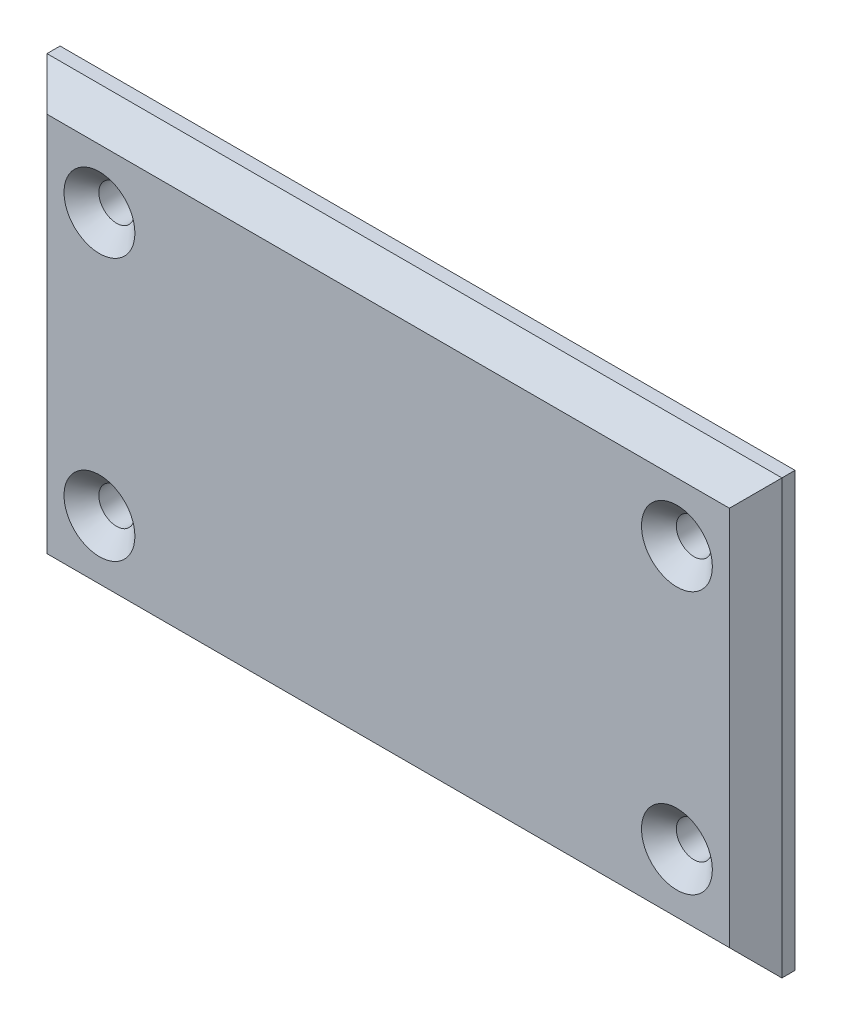
ISO-10303-21;
HEADER;
FILE_DESCRIPTION(('STEP AP214'),'2;1');
FILE_NAME('part.step','',(''),(''),'','','');
FILE_SCHEMA(('AUTOMOTIVE_DESIGN { 1 0 10303 214 1 1 1 1 }'));
ENDSEC;
DATA;
#1=APPLICATION_CONTEXT('core data for automotive mechanical design processes');
#2=APPLICATION_PROTOCOL_DEFINITION('international standard','automotive_design',2000,#1);
#3=PRODUCT_CONTEXT('',#1,'mechanical');
#4=PRODUCT('Part','Part','',(#3));
#5=PRODUCT_RELATED_PRODUCT_CATEGORY('part','',(#4));
#6=PRODUCT_DEFINITION_FORMATION('','',#4);
#7=PRODUCT_DEFINITION_CONTEXT('part definition',#1,'design');
#8=PRODUCT_DEFINITION('design','',#6,#7);
#9=PRODUCT_DEFINITION_SHAPE('','',#8);
#10=(LENGTH_UNIT() NAMED_UNIT(*) SI_UNIT(.MILLI.,.METRE.));
#11=(NAMED_UNIT(*) PLANE_ANGLE_UNIT() SI_UNIT($,.RADIAN.));
#12=(NAMED_UNIT(*) SI_UNIT($,.STERADIAN.) SOLID_ANGLE_UNIT());
#13=UNCERTAINTY_MEASURE_WITH_UNIT(LENGTH_MEASURE(1.E-05),#10,'distance_accuracy_value','');
#14=(GEOMETRIC_REPRESENTATION_CONTEXT(3) GLOBAL_UNCERTAINTY_ASSIGNED_CONTEXT((#13)) GLOBAL_UNIT_ASSIGNED_CONTEXT((#10,
#11,#12)) REPRESENTATION_CONTEXT('',''));
#15=CARTESIAN_POINT('',(0.,0.,0.));
#16=DIRECTION('',(0.,0.,1.));
#17=DIRECTION('',(1.,0.,0.));
#18=AXIS2_PLACEMENT_3D('',#15,#16,#17);
#19=CARTESIAN_POINT('',(140.,82.5,15.0000000000002));
#20=DIRECTION('',(-1.,0.,0.));
#21=DIRECTION('',(0.,-1.,0.));
#22=AXIS2_PLACEMENT_3D('',#19,#20,#21);
#23=PLANE('',#22);
#24=DIRECTION('',(0.,0.,-1.));
#25=VECTOR('',#24,1.);
#26=CARTESIAN_POINT('',(140.,82.5,15.0000000000002));
#27=LINE('',#26,#25);
#28=CARTESIAN_POINT('',(140.,82.5,5.00000000000023));
#29=VERTEX_POINT('',#28);
#30=CARTESIAN_POINT('',(140.,82.5,2.22044604925031E-13));
#31=VERTEX_POINT('',#30);
#32=EDGE_CURVE('E88',#29,#31,#27,.T.);
#33=ORIENTED_EDGE('',*,*,#32,.F.);
#34=DIRECTION('',(0.,-1.,0.));
#35=VECTOR('',#34,1.);
#36=CARTESIAN_POINT('',(140.,-82.5,5.00000000000023));
#37=LINE('',#36,#35);
#38=CARTESIAN_POINT('',(140.,-82.5,5.00000000000023));
#39=VERTEX_POINT('',#38);
#40=EDGE_CURVE('E58',#29,#39,#37,.T.);
#41=ORIENTED_EDGE('',*,*,#40,.T.);
#42=DIRECTION('',(0.,0.,-1.));
#43=VECTOR('',#42,1.);
#44=CARTESIAN_POINT('',(140.,-82.5,15.0000000000002));
#45=LINE('',#44,#43);
#46=CARTESIAN_POINT('',(140.,-82.5,2.22044604925031E-13));
#47=VERTEX_POINT('',#46);
#48=EDGE_CURVE('E108',#39,#47,#45,.T.);
#49=ORIENTED_EDGE('',*,*,#48,.T.);
#50=DIRECTION('',(0.,1.,0.));
#51=VECTOR('',#50,1.);
#52=CARTESIAN_POINT('',(140.,82.5,2.22044604925031E-13));
#53=LINE('',#52,#51);
#54=EDGE_CURVE('E104',#47,#31,#53,.T.);
#55=ORIENTED_EDGE('',*,*,#54,.T.);
#56=EDGE_LOOP('',(#33,#41,#49,#55));
#57=FACE_BOUND('',#56,.T.);
#58=ADVANCED_FACE('F34',(#57),#23,.F.);
#59=CARTESIAN_POINT('',(-140.,82.5,15.));
#60=DIRECTION('',(0.,-1.,0.));
#61=DIRECTION('',(0.,0.,-1.));
#62=AXIS2_PLACEMENT_3D('',#59,#60,#61);
#63=PLANE('',#62);
#64=DIRECTION('',(0.,0.,-1.));
#65=VECTOR('',#64,1.);
#66=CARTESIAN_POINT('',(-140.,82.5,15.));
#67=LINE('',#66,#65);
#68=CARTESIAN_POINT('',(-140.,82.5,5.));
#69=VERTEX_POINT('',#68);
#70=CARTESIAN_POINT('',(-140.,82.5,0.));
#71=VERTEX_POINT('',#70);
#72=EDGE_CURVE('E98',#69,#71,#67,.T.);
#73=ORIENTED_EDGE('',*,*,#72,.F.);
#74=DIRECTION('',(1.,0.,0.));
#75=VECTOR('',#74,1.);
#76=CARTESIAN_POINT('',(140.,82.5,5.00000000000023));
#77=LINE('',#76,#75);
#78=EDGE_CURVE('E95',#69,#29,#77,.T.);
#79=ORIENTED_EDGE('',*,*,#78,.T.);
#80=ORIENTED_EDGE('',*,*,#32,.T.);
#81=DIRECTION('',(-1.,0.,0.));
#82=VECTOR('',#81,1.);
#83=CARTESIAN_POINT('',(-140.,82.5,0.));
#84=LINE('',#83,#82);
#85=EDGE_CURVE('E92',#31,#71,#84,.T.);
#86=ORIENTED_EDGE('',*,*,#85,.T.);
#87=EDGE_LOOP('',(#73,#79,#80,#86));
#88=FACE_BOUND('',#87,.T.);
#89=ADVANCED_FACE('F91',(#88),#63,.F.);
#90=CARTESIAN_POINT('',(-140.,82.5,15.));
#91=DIRECTION('',(1.,0.,0.));
#92=DIRECTION('',(0.,1.,0.));
#93=AXIS2_PLACEMENT_3D('',#90,#91,#92);
#94=PLANE('',#93);
#95=DIRECTION('',(0.,0.,-1.));
#96=VECTOR('',#95,1.);
#97=CARTESIAN_POINT('',(-140.,-82.5,15.));
#98=LINE('',#97,#96);
#99=CARTESIAN_POINT('',(-140.,-82.5,5.));
#100=VERTEX_POINT('',#99);
#101=CARTESIAN_POINT('',(-140.,-82.5,0.));
#102=VERTEX_POINT('',#101);
#103=EDGE_CURVE('E123',#100,#102,#98,.T.);
#104=ORIENTED_EDGE('',*,*,#103,.F.);
#105=DIRECTION('',(0.,1.,0.));
#106=VECTOR('',#105,1.);
#107=CARTESIAN_POINT('',(-140.,82.5,5.));
#108=LINE('',#107,#106);
#109=EDGE_CURVE('E11',#100,#69,#108,.T.);
#110=ORIENTED_EDGE('',*,*,#109,.T.);
#111=ORIENTED_EDGE('',*,*,#72,.T.);
#112=DIRECTION('',(0.,-1.,0.));
#113=VECTOR('',#112,1.);
#114=CARTESIAN_POINT('',(-140.,82.5,0.));
#115=LINE('',#114,#113);
#116=EDGE_CURVE('E106',#71,#102,#115,.T.);
#117=ORIENTED_EDGE('',*,*,#116,.T.);
#118=EDGE_LOOP('',(#104,#110,#111,#117));
#119=FACE_BOUND('',#118,.T.);
#120=ADVANCED_FACE('F195',(#119),#94,.F.);
#121=CARTESIAN_POINT('',(-140.,-82.5,15.));
#122=DIRECTION('',(0.,1.,0.));
#123=DIRECTION('',(0.,0.,1.));
#124=AXIS2_PLACEMENT_3D('',#121,#122,#123);
#125=PLANE('',#124);
#126=ORIENTED_EDGE('',*,*,#48,.F.);
#127=DIRECTION('',(-1.,0.,0.));
#128=VECTOR('',#127,1.);
#129=CARTESIAN_POINT('',(-140.,-82.5,5.));
#130=LINE('',#129,#128);
#131=EDGE_CURVE('E43',#39,#100,#130,.T.);
#132=ORIENTED_EDGE('',*,*,#131,.T.);
#133=ORIENTED_EDGE('',*,*,#103,.T.);
#134=DIRECTION('',(1.,0.,0.));
#135=VECTOR('',#134,1.);
#136=CARTESIAN_POINT('',(-140.,-82.5,0.));
#137=LINE('',#136,#135);
#138=EDGE_CURVE('E120',#102,#47,#137,.T.);
#139=ORIENTED_EDGE('',*,*,#138,.T.);
#140=EDGE_LOOP('',(#126,#132,#133,#139));
#141=FACE_BOUND('',#140,.T.);
#142=ADVANCED_FACE('F225',(#141),#125,.F.);
#143=CARTESIAN_POINT('',(0.,0.,15.));
#144=DIRECTION('',(0.,0.,1.));
#145=DIRECTION('',(1.,0.,0.));
#146=AXIS2_PLACEMENT_3D('',#143,#144,#145);
#147=PLANE('',#146);
#148=CARTESIAN_POINT('',(-110.,50.,15.));
#149=DIRECTION('',(0.,0.,1.));
#150=DIRECTION('',(1.,0.,0.));
#151=AXIS2_PLACEMENT_3D('',#148,#149,#150);
#152=CIRCLE('',#151,13.5);
#153=CARTESIAN_POINT('',(-96.4999999999998,50.,15.));
#154=VERTEX_POINT('',#153);
#155=EDGE_CURVE('E351',#154,#154,#152,.T.);
#156=ORIENTED_EDGE('',*,*,#155,.F.);
#157=EDGE_LOOP('',(#156));
#158=FACE_BOUND('',#157,.T.);
#159=CARTESIAN_POINT('',(110.,50.,15.0000000000002));
#160=DIRECTION('',(0.,0.,1.));
#161=DIRECTION('',(1.,0.,0.));
#162=AXIS2_PLACEMENT_3D('',#159,#160,#161);
#163=CIRCLE('',#162,13.5);
#164=CARTESIAN_POINT('',(123.5,50.,15.0000000000002));
#165=VERTEX_POINT('',#164);
#166=EDGE_CURVE('E159',#165,#165,#163,.T.);
#167=ORIENTED_EDGE('',*,*,#166,.F.);
#168=EDGE_LOOP('',(#167));
#169=FACE_BOUND('',#168,.T.);
#170=CARTESIAN_POINT('',(110.,-50.,15.0000000000002));
#171=DIRECTION('',(0.,0.,1.));
#172=DIRECTION('',(1.,0.,0.));
#173=AXIS2_PLACEMENT_3D('',#170,#171,#172);
#174=CIRCLE('',#173,13.5);
#175=CARTESIAN_POINT('',(123.5,-50.,15.0000000000002));
#176=VERTEX_POINT('',#175);
#177=EDGE_CURVE('E152',#176,#176,#174,.T.);
#178=ORIENTED_EDGE('',*,*,#177,.F.);
#179=EDGE_LOOP('',(#178));
#180=FACE_BOUND('',#179,.T.);
#181=CARTESIAN_POINT('',(-110.,-50.,15.));
#182=DIRECTION('',(0.,0.,1.));
#183=DIRECTION('',(1.,0.,0.));
#184=AXIS2_PLACEMENT_3D('',#181,#182,#183);
#185=CIRCLE('',#184,13.5);
#186=CARTESIAN_POINT('',(-96.4999999999999,-50.,15.));
#187=VERTEX_POINT('',#186);
#188=EDGE_CURVE('E148',#187,#187,#185,.T.);
#189=ORIENTED_EDGE('',*,*,#188,.F.);
#190=EDGE_LOOP('',(#189));
#191=FACE_BOUND('',#190,.T.);
#192=DIRECTION('',(0.,1.,0.));
#193=VECTOR('',#192,1.);
#194=CARTESIAN_POINT('',(130.,82.5,15.0000000000002));
#195=LINE('',#194,#193);
#196=CARTESIAN_POINT('',(130.,-72.4999999999998,15.0000000000002));
#197=VERTEX_POINT('',#196);
#198=CARTESIAN_POINT('',(130.,72.5000000000002,15.0000000000002));
#199=VERTEX_POINT('',#198);
#200=EDGE_CURVE('E129',#197,#199,#195,.T.);
#201=ORIENTED_EDGE('',*,*,#200,.T.);
#202=DIRECTION('',(-1.,0.,0.));
#203=VECTOR('',#202,1.);
#204=CARTESIAN_POINT('',(-140.,72.5,15.));
#205=LINE('',#204,#203);
#206=CARTESIAN_POINT('',(-130.,72.4999999999996,15.));
#207=VERTEX_POINT('',#206);
#208=EDGE_CURVE('E131',#199,#207,#205,.T.);
#209=ORIENTED_EDGE('',*,*,#208,.T.);
#210=DIRECTION('',(0.,-1.,0.));
#211=VECTOR('',#210,1.);
#212=CARTESIAN_POINT('',(-130.,-82.5000000000002,15.));
#213=LINE('',#212,#211);
#214=CARTESIAN_POINT('',(-130.,-72.5000000000005,15.));
#215=VERTEX_POINT('',#214);
#216=EDGE_CURVE('E97',#207,#215,#213,.T.);
#217=ORIENTED_EDGE('',*,*,#216,.T.);
#218=DIRECTION('',(1.,0.,0.));
#219=VECTOR('',#218,1.);
#220=CARTESIAN_POINT('',(140.,-72.5,15.0000000000002));
#221=LINE('',#220,#219);
#222=EDGE_CURVE('E127',#215,#197,#221,.T.);
#223=ORIENTED_EDGE('',*,*,#222,.T.);
#224=EDGE_LOOP('',(#201,#209,#217,#223));
#225=FACE_BOUND('',#224,.T.);
#226=ADVANCED_FACE('F223',(#158,#169,#180,#191,#225),#147,.T.);
#227=CARTESIAN_POINT('',(0.,0.,0.));
#228=DIRECTION('',(0.,0.,1.));
#229=DIRECTION('',(1.,0.,0.));
#230=AXIS2_PLACEMENT_3D('',#227,#228,#229);
#231=PLANE('',#230);
#232=CARTESIAN_POINT('',(-110.,50.,0.));
#233=DIRECTION('',(0.,0.,1.));
#234=DIRECTION('',(1.,0.,0.));
#235=AXIS2_PLACEMENT_3D('',#232,#233,#234);
#236=CIRCLE('',#235,6.74999999999999);
#237=CARTESIAN_POINT('',(-103.25,50.,0.));
#238=VERTEX_POINT('',#237);
#239=EDGE_CURVE('E38',#238,#238,#236,.T.);
#240=ORIENTED_EDGE('',*,*,#239,.T.);
#241=EDGE_LOOP('',(#240));
#242=FACE_BOUND('',#241,.T.);
#243=CARTESIAN_POINT('',(110.,50.,2.22044604925031E-13));
#244=DIRECTION('',(0.,0.,1.));
#245=DIRECTION('',(1.,0.,0.));
#246=AXIS2_PLACEMENT_3D('',#243,#244,#245);
#247=CIRCLE('',#246,6.74999999999999);
#248=CARTESIAN_POINT('',(116.75,50.,2.22044604925031E-13));
#249=VERTEX_POINT('',#248);
#250=EDGE_CURVE('E150',#249,#249,#247,.T.);
#251=ORIENTED_EDGE('',*,*,#250,.T.);
#252=EDGE_LOOP('',(#251));
#253=FACE_BOUND('',#252,.T.);
#254=CARTESIAN_POINT('',(110.,-50.,2.22044604925031E-13));
#255=DIRECTION('',(0.,0.,1.));
#256=DIRECTION('',(1.,0.,0.));
#257=AXIS2_PLACEMENT_3D('',#254,#255,#256);
#258=CIRCLE('',#257,6.74999999999999);
#259=CARTESIAN_POINT('',(116.75,-50.,2.22044604925031E-13));
#260=VERTEX_POINT('',#259);
#261=EDGE_CURVE('E146',#260,#260,#258,.T.);
#262=ORIENTED_EDGE('',*,*,#261,.T.);
#263=EDGE_LOOP('',(#262));
#264=FACE_BOUND('',#263,.T.);
#265=CARTESIAN_POINT('',(-110.,-50.,0.));
#266=DIRECTION('',(0.,0.,1.));
#267=DIRECTION('',(1.,0.,0.));
#268=AXIS2_PLACEMENT_3D('',#265,#266,#267);
#269=CIRCLE('',#268,6.74999999999999);
#270=CARTESIAN_POINT('',(-103.25,-50.,0.));
#271=VERTEX_POINT('',#270);
#272=EDGE_CURVE('E140',#271,#271,#269,.T.);
#273=ORIENTED_EDGE('',*,*,#272,.T.);
#274=EDGE_LOOP('',(#273));
#275=FACE_BOUND('',#274,.T.);
#276=ORIENTED_EDGE('',*,*,#54,.F.);
#277=ORIENTED_EDGE('',*,*,#138,.F.);
#278=ORIENTED_EDGE('',*,*,#116,.F.);
#279=ORIENTED_EDGE('',*,*,#85,.F.);
#280=EDGE_LOOP('',(#276,#277,#278,#279));
#281=FACE_BOUND('',#280,.T.);
#282=ADVANCED_FACE('F102',(#242,#253,#264,#275,#281),#231,.F.);
#283=CARTESIAN_POINT('',(2.22044604925031E-13,-72.5,15.));
#284=DIRECTION('',(0.,-0.707106781186548,0.707106781186546));
#285=DIRECTION('',(-1.,0.,0.));
#286=AXIS2_PLACEMENT_3D('',#283,#284,#285);
#287=PLANE('',#286);
#288=DIRECTION('',(0.577350269189625,0.577350269189626,0.577350269189627));
#289=VECTOR('',#288,1.);
#290=CARTESIAN_POINT('',(-105.833333333333,-48.3333333333333,39.1666666666668));
#291=LINE('',#290,#289);
#292=EDGE_CURVE('E113',#100,#215,#291,.T.);
#293=ORIENTED_EDGE('',*,*,#292,.F.);
#294=ORIENTED_EDGE('',*,*,#131,.F.);
#295=DIRECTION('',(-0.577350269189625,0.577350269189625,0.577350269189627));
#296=VECTOR('',#295,1.);
#297=CARTESIAN_POINT('',(86.6666666666669,-29.1666666666668,58.3333333333335));
#298=LINE('',#297,#296);
#299=EDGE_CURVE('E110',#197,#39,#298,.F.);
#300=ORIENTED_EDGE('',*,*,#299,.F.);
#301=ORIENTED_EDGE('',*,*,#222,.F.);
#302=EDGE_LOOP('',(#293,#294,#300,#301));
#303=FACE_BOUND('',#302,.T.);
#304=ADVANCED_FACE('F36',(#303),#287,.T.);
#305=CARTESIAN_POINT('',(130.,2.22044604925031E-13,15.0000000000002));
#306=DIRECTION('',(0.707106781186548,0.,0.707106781186546));
#307=DIRECTION('',(0.,-1.,0.));
#308=AXIS2_PLACEMENT_3D('',#305,#306,#307);
#309=PLANE('',#308);
#310=ORIENTED_EDGE('',*,*,#299,.T.);
#311=ORIENTED_EDGE('',*,*,#40,.F.);
#312=DIRECTION('',(-0.577350269189625,-0.577350269189625,0.577350269189627));
#313=VECTOR('',#312,1.);
#314=CARTESIAN_POINT('',(105.833333333334,48.3333333333333,39.1666666666669));
#315=LINE('',#314,#313);
#316=EDGE_CURVE('E139',#199,#29,#315,.F.);
#317=ORIENTED_EDGE('',*,*,#316,.F.);
#318=ORIENTED_EDGE('',*,*,#200,.F.);
#319=EDGE_LOOP('',(#310,#311,#317,#318));
#320=FACE_BOUND('',#319,.T.);
#321=ADVANCED_FACE('F204',(#320),#309,.T.);
#322=CARTESIAN_POINT('',(-130.,-4.44089209850063E-13,15.));
#323=DIRECTION('',(-0.707106781186549,0.,0.707106781186546));
#324=DIRECTION('',(0.,1.,0.));
#325=AXIS2_PLACEMENT_3D('',#322,#323,#324);
#326=PLANE('',#325);
#327=ORIENTED_EDGE('',*,*,#292,.T.);
#328=ORIENTED_EDGE('',*,*,#216,.F.);
#329=DIRECTION('',(-0.577350269189625,0.577350269189626,-0.577350269189627));
#330=VECTOR('',#329,1.);
#331=CARTESIAN_POINT('',(-105.833333333333,48.3333333333333,39.1666666666668));
#332=LINE('',#331,#330);
#333=EDGE_CURVE('E137',#69,#207,#332,.F.);
#334=ORIENTED_EDGE('',*,*,#333,.F.);
#335=ORIENTED_EDGE('',*,*,#109,.F.);
#336=EDGE_LOOP('',(#327,#328,#334,#335));
#337=FACE_BOUND('',#336,.T.);
#338=ADVANCED_FACE('F201',(#337),#326,.T.);
#339=CARTESIAN_POINT('',(0.,72.5,15.));
#340=DIRECTION('',(0.,0.707106781186548,0.707106781186546));
#341=DIRECTION('',(1.,0.,0.));
#342=AXIS2_PLACEMENT_3D('',#339,#340,#341);
#343=PLANE('',#342);
#344=ORIENTED_EDGE('',*,*,#316,.T.);
#345=ORIENTED_EDGE('',*,*,#78,.F.);
#346=ORIENTED_EDGE('',*,*,#333,.T.);
#347=ORIENTED_EDGE('',*,*,#208,.F.);
#348=EDGE_LOOP('',(#344,#345,#346,#347));
#349=FACE_BOUND('',#348,.T.);
#350=ADVANCED_FACE('F188',(#349),#343,.T.);
#351=CARTESIAN_POINT('',(-110.,-50.,15.));
#352=DIRECTION('',(0.,0.,1.));
#353=DIRECTION('',(1.,0.,0.));
#354=AXIS2_PLACEMENT_3D('',#351,#352,#353);
#355=CYLINDRICAL_SURFACE('',#354,6.74999999999999);
#356=CARTESIAN_POINT('',(-110.,-50.,8.48160077005233));
#357=DIRECTION('',(0.,0.,1.));
#358=DIRECTION('',(1.,0.,0.));
#359=AXIS2_PLACEMENT_3D('',#356,#357,#358);
#360=CIRCLE('',#359,6.74999999999999);
#361=CARTESIAN_POINT('',(-103.25,-50.,8.48160077005233));
#362=VERTEX_POINT('',#361);
#363=EDGE_CURVE('E116',#362,#362,#360,.T.);
#364=ORIENTED_EDGE('',*,*,#363,.T.);
#365=EDGE_LOOP('',(#364));
#366=FACE_BOUND('',#365,.T.);
#367=ORIENTED_EDGE('',*,*,#272,.F.);
#368=EDGE_LOOP('',(#367));
#369=FACE_BOUND('',#368,.T.);
#370=ADVANCED_FACE('F174',(#366,#369),#355,.F.);
#371=CARTESIAN_POINT('',(-110.,-50.,15.));
#372=DIRECTION('',(0.,0.,1.));
#373=DIRECTION('',(1.,0.,0.));
#374=AXIS2_PLACEMENT_3D('',#371,#372,#373);
#375=CONICAL_SURFACE('',#374,13.5,0.802851455917393);
#376=ORIENTED_EDGE('',*,*,#363,.F.);
#377=EDGE_LOOP('',(#376));
#378=FACE_BOUND('',#377,.T.);
#379=ORIENTED_EDGE('',*,*,#188,.T.);
#380=EDGE_LOOP('',(#379));
#381=FACE_BOUND('',#380,.T.);
#382=ADVANCED_FACE('F177',(#378,#381),#375,.F.);
#383=CARTESIAN_POINT('',(110.,-50.,15.0000000000002));
#384=DIRECTION('',(0.,0.,1.));
#385=DIRECTION('',(1.,0.,0.));
#386=AXIS2_PLACEMENT_3D('',#383,#384,#385);
#387=CYLINDRICAL_SURFACE('',#386,6.74999999999999);
#388=CARTESIAN_POINT('',(110.,-50.,8.48160077005245));
#389=DIRECTION('',(0.,0.,1.));
#390=DIRECTION('',(1.,0.,0.));
#391=AXIS2_PLACEMENT_3D('',#388,#389,#390);
#392=CIRCLE('',#391,6.74999999999999);
#393=CARTESIAN_POINT('',(116.75,-50.,8.48160077005245));
#394=VERTEX_POINT('',#393);
#395=EDGE_CURVE('E149',#394,#394,#392,.T.);
#396=ORIENTED_EDGE('',*,*,#395,.T.);
#397=EDGE_LOOP('',(#396));
#398=FACE_BOUND('',#397,.T.);
#399=ORIENTED_EDGE('',*,*,#261,.F.);
#400=EDGE_LOOP('',(#399));
#401=FACE_BOUND('',#400,.T.);
#402=ADVANCED_FACE('F179',(#398,#401),#387,.F.);
#403=CARTESIAN_POINT('',(110.,-50.,15.0000000000002));
#404=DIRECTION('',(0.,0.,1.));
#405=DIRECTION('',(1.,0.,0.));
#406=AXIS2_PLACEMENT_3D('',#403,#404,#405);
#407=CONICAL_SURFACE('',#406,13.5,0.802851455917393);
#408=ORIENTED_EDGE('',*,*,#395,.F.);
#409=EDGE_LOOP('',(#408));
#410=FACE_BOUND('',#409,.T.);
#411=ORIENTED_EDGE('',*,*,#177,.T.);
#412=EDGE_LOOP('',(#411));
#413=FACE_BOUND('',#412,.T.);
#414=ADVANCED_FACE('F185',(#410,#413),#407,.F.);
#415=CARTESIAN_POINT('',(110.,50.,15.0000000000002));
#416=DIRECTION('',(0.,0.,1.));
#417=DIRECTION('',(1.,0.,0.));
#418=AXIS2_PLACEMENT_3D('',#415,#416,#417);
#419=CYLINDRICAL_SURFACE('',#418,6.74999999999999);
#420=CARTESIAN_POINT('',(110.,50.,8.48160077005245));
#421=DIRECTION('',(0.,0.,1.));
#422=DIRECTION('',(1.,0.,0.));
#423=AXIS2_PLACEMENT_3D('',#420,#421,#422);
#424=CIRCLE('',#423,6.74999999999999);
#425=CARTESIAN_POINT('',(116.75,50.,8.48160077005245));
#426=VERTEX_POINT('',#425);
#427=EDGE_CURVE('E153',#426,#426,#424,.T.);
#428=ORIENTED_EDGE('',*,*,#427,.T.);
#429=EDGE_LOOP('',(#428));
#430=FACE_BOUND('',#429,.T.);
#431=ORIENTED_EDGE('',*,*,#250,.F.);
#432=EDGE_LOOP('',(#431));
#433=FACE_BOUND('',#432,.T.);
#434=ADVANCED_FACE('F303',(#430,#433),#419,.F.);
#435=CARTESIAN_POINT('',(110.,50.,15.0000000000002));
#436=DIRECTION('',(0.,0.,1.));
#437=DIRECTION('',(1.,0.,0.));
#438=AXIS2_PLACEMENT_3D('',#435,#436,#437);
#439=CONICAL_SURFACE('',#438,13.5,0.802851455917393);
#440=ORIENTED_EDGE('',*,*,#427,.F.);
#441=EDGE_LOOP('',(#440));
#442=FACE_BOUND('',#441,.T.);
#443=ORIENTED_EDGE('',*,*,#166,.T.);
#444=EDGE_LOOP('',(#443));
#445=FACE_BOUND('',#444,.T.);
#446=ADVANCED_FACE('F313',(#442,#445),#439,.F.);
#447=CARTESIAN_POINT('',(-110.,50.,15.));
#448=DIRECTION('',(0.,0.,1.));
#449=DIRECTION('',(1.,0.,0.));
#450=AXIS2_PLACEMENT_3D('',#447,#448,#449);
#451=CYLINDRICAL_SURFACE('',#450,6.74999999999999);
#452=CARTESIAN_POINT('',(-110.,50.,8.48160077005233));
#453=DIRECTION('',(0.,0.,1.));
#454=DIRECTION('',(1.,0.,0.));
#455=AXIS2_PLACEMENT_3D('',#452,#453,#454);
#456=CIRCLE('',#455,6.74999999999999);
#457=CARTESIAN_POINT('',(-103.25,50.,8.48160077005233));
#458=VERTEX_POINT('',#457);
#459=EDGE_CURVE('E349',#458,#458,#456,.T.);
#460=ORIENTED_EDGE('',*,*,#459,.T.);
#461=EDGE_LOOP('',(#460));
#462=FACE_BOUND('',#461,.T.);
#463=ORIENTED_EDGE('',*,*,#239,.F.);
#464=EDGE_LOOP('',(#463));
#465=FACE_BOUND('',#464,.T.);
#466=ADVANCED_FACE('F322',(#462,#465),#451,.F.);
#467=CARTESIAN_POINT('',(-110.,50.,15.));
#468=DIRECTION('',(0.,0.,1.));
#469=DIRECTION('',(1.,0.,0.));
#470=AXIS2_PLACEMENT_3D('',#467,#468,#469);
#471=CONICAL_SURFACE('',#470,13.5,0.802851455917393);
#472=ORIENTED_EDGE('',*,*,#459,.F.);
#473=EDGE_LOOP('',(#472));
#474=FACE_BOUND('',#473,.T.);
#475=ORIENTED_EDGE('',*,*,#155,.T.);
#476=EDGE_LOOP('',(#475));
#477=FACE_BOUND('',#476,.T.);
#478=ADVANCED_FACE('F332',(#474,#477),#471,.F.);
#479=CLOSED_SHELL('',(#58,#89,#120,#142,#226,#282,#304,#321,#338,#350,#370,#382,#402,#414,#434,
#446,#466,#478));
#480=MANIFOLD_SOLID_BREP('B2',#479);
#481=ADVANCED_BREP_SHAPE_REPRESENTATION('',(#18,#480),#14);
#482=SHAPE_DEFINITION_REPRESENTATION(#9,#481);
ENDSEC;
END-ISO-10303-21;
